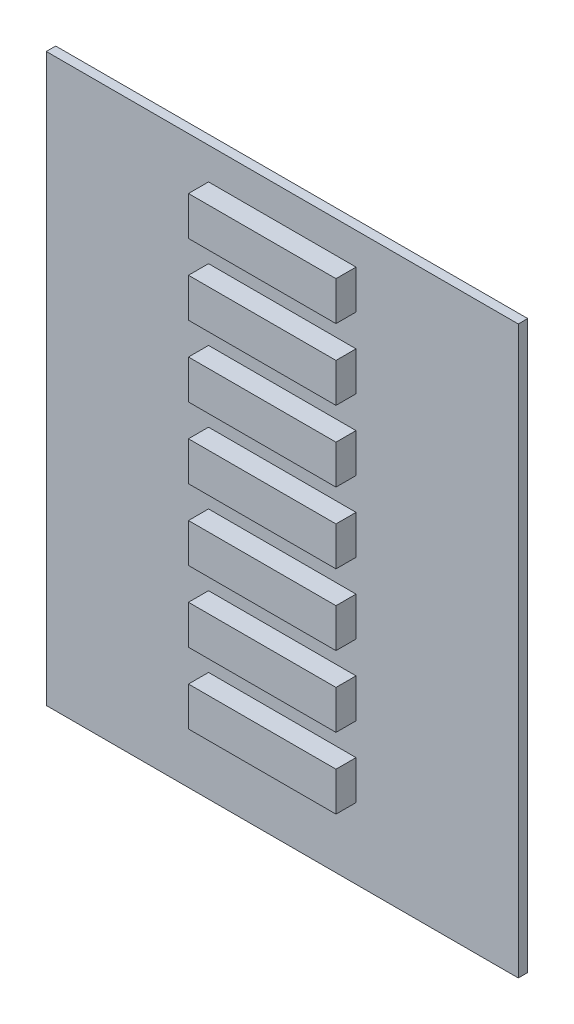
ISO-10303-21;
HEADER;
FILE_DESCRIPTION(('STEP AP214'),'2;1');
FILE_NAME('part.step','',(''),(''),'','','');
FILE_SCHEMA(('AUTOMOTIVE_DESIGN { 1 0 10303 214 1 1 1 1 }'));
ENDSEC;
DATA;
#1=APPLICATION_CONTEXT('core data for automotive mechanical design processes');
#2=APPLICATION_PROTOCOL_DEFINITION('international standard','automotive_design',2000,#1);
#3=PRODUCT_CONTEXT('',#1,'mechanical');
#4=PRODUCT('Part','Part','',(#3));
#5=PRODUCT_RELATED_PRODUCT_CATEGORY('part','',(#4));
#6=PRODUCT_DEFINITION_FORMATION('','',#4);
#7=PRODUCT_DEFINITION_CONTEXT('part definition',#1,'design');
#8=PRODUCT_DEFINITION('design','',#6,#7);
#9=PRODUCT_DEFINITION_SHAPE('','',#8);
#10=(LENGTH_UNIT() NAMED_UNIT(*) SI_UNIT(.MILLI.,.METRE.));
#11=(NAMED_UNIT(*) PLANE_ANGLE_UNIT() SI_UNIT($,.RADIAN.));
#12=(NAMED_UNIT(*) SI_UNIT($,.STERADIAN.) SOLID_ANGLE_UNIT());
#13=UNCERTAINTY_MEASURE_WITH_UNIT(LENGTH_MEASURE(1.E-05),#10,'distance_accuracy_value','');
#14=(GEOMETRIC_REPRESENTATION_CONTEXT(3) GLOBAL_UNCERTAINTY_ASSIGNED_CONTEXT((#13)) GLOBAL_UNIT_ASSIGNED_CONTEXT((#10,
#11,#12)) REPRESENTATION_CONTEXT('',''));
#15=CARTESIAN_POINT('',(0.,0.,0.));
#16=DIRECTION('',(0.,0.,1.));
#17=DIRECTION('',(1.,0.,0.));
#18=AXIS2_PLACEMENT_3D('',#15,#16,#17);
#19=CARTESIAN_POINT('',(0.,0.,-41.));
#20=DIRECTION('',(0.,0.,1.));
#21=DIRECTION('',(1.,0.,0.));
#22=AXIS2_PLACEMENT_3D('',#19,#20,#21);
#23=PLANE('',#22);
#24=DIRECTION('',(0.,1.,0.));
#25=VECTOR('',#24,1.);
#26=CARTESIAN_POINT('',(40.,48.,-41.));
#27=LINE('',#26,#25);
#28=CARTESIAN_POINT('',(40.,-48.,-41.));
#29=VERTEX_POINT('',#28);
#30=CARTESIAN_POINT('',(40.,48.,-41.));
#31=VERTEX_POINT('',#30);
#32=EDGE_CURVE('E536',#29,#31,#27,.T.);
#33=ORIENTED_EDGE('',*,*,#32,.T.);
#34=DIRECTION('',(-1.,0.,0.));
#35=VECTOR('',#34,1.);
#36=CARTESIAN_POINT('',(-40.,48.,-41.));
#37=LINE('',#36,#35);
#38=CARTESIAN_POINT('',(-40.,48.,-41.));
#39=VERTEX_POINT('',#38);
#40=EDGE_CURVE('E540',#31,#39,#37,.T.);
#41=ORIENTED_EDGE('',*,*,#40,.T.);
#42=DIRECTION('',(0.,-1.,0.));
#43=VECTOR('',#42,1.);
#44=CARTESIAN_POINT('',(-40.,48.,-41.));
#45=LINE('',#44,#43);
#46=CARTESIAN_POINT('',(-40.,-48.,-41.));
#47=VERTEX_POINT('',#46);
#48=EDGE_CURVE('E543',#39,#47,#45,.T.);
#49=ORIENTED_EDGE('',*,*,#48,.T.);
#50=DIRECTION('',(1.,0.,0.));
#51=VECTOR('',#50,1.);
#52=CARTESIAN_POINT('',(-40.,-48.,-41.));
#53=LINE('',#52,#51);
#54=EDGE_CURVE('E545',#47,#29,#53,.T.);
#55=ORIENTED_EDGE('',*,*,#54,.T.);
#56=EDGE_LOOP('',(#33,#41,#49,#55));
#57=FACE_BOUND('',#56,.T.);
#58=DIRECTION('',(-1.,0.,0.));
#59=VECTOR('',#58,1.);
#60=CARTESIAN_POINT('',(0.,36.,-41.));
#61=LINE('',#60,#59);
#62=CARTESIAN_POINT('',(12.5,36.,-41.));
#63=VERTEX_POINT('',#62);
#64=CARTESIAN_POINT('',(-12.5,36.,-41.));
#65=VERTEX_POINT('',#64);
#66=EDGE_CURVE('E529',#63,#65,#61,.T.);
#67=ORIENTED_EDGE('',*,*,#66,.T.);
#68=DIRECTION('',(0.,1.,0.));
#69=VECTOR('',#68,1.);
#70=CARTESIAN_POINT('',(-12.5,0.,-41.));
#71=LINE('',#70,#69);
#72=CARTESIAN_POINT('',(-12.5,42.6,-41.));
#73=VERTEX_POINT('',#72);
#74=EDGE_CURVE('E532',#65,#73,#71,.T.);
#75=ORIENTED_EDGE('',*,*,#74,.T.);
#76=DIRECTION('',(1.,0.,0.));
#77=VECTOR('',#76,1.);
#78=CARTESIAN_POINT('',(0.,42.6,-41.));
#79=LINE('',#78,#77);
#80=CARTESIAN_POINT('',(12.5,42.6,-41.));
#81=VERTEX_POINT('',#80);
#82=EDGE_CURVE('E523',#73,#81,#79,.T.);
#83=ORIENTED_EDGE('',*,*,#82,.T.);
#84=DIRECTION('',(0.,-1.,0.));
#85=VECTOR('',#84,1.);
#86=CARTESIAN_POINT('',(12.5,0.,-41.));
#87=LINE('',#86,#85);
#88=EDGE_CURVE('E526',#81,#63,#87,.T.);
#89=ORIENTED_EDGE('',*,*,#88,.T.);
#90=EDGE_LOOP('',(#67,#75,#83,#89));
#91=FACE_BOUND('',#90,.T.);
#92=DIRECTION('',(-1.,0.,0.));
#93=VECTOR('',#92,1.);
#94=CARTESIAN_POINT('',(0.,24.,-41.));
#95=LINE('',#94,#93);
#96=CARTESIAN_POINT('',(12.5,24.,-41.));
#97=VERTEX_POINT('',#96);
#98=CARTESIAN_POINT('',(-12.5,24.,-41.));
#99=VERTEX_POINT('',#98);
#100=EDGE_CURVE('E497',#97,#99,#95,.T.);
#101=ORIENTED_EDGE('',*,*,#100,.T.);
#102=DIRECTION('',(0.,1.,0.));
#103=VECTOR('',#102,1.);
#104=CARTESIAN_POINT('',(-12.5,0.,-41.));
#105=LINE('',#104,#103);
#106=CARTESIAN_POINT('',(-12.5,30.6,-41.));
#107=VERTEX_POINT('',#106);
#108=EDGE_CURVE('E500',#99,#107,#105,.T.);
#109=ORIENTED_EDGE('',*,*,#108,.T.);
#110=DIRECTION('',(1.,0.,0.));
#111=VECTOR('',#110,1.);
#112=CARTESIAN_POINT('',(0.,30.6,-41.));
#113=LINE('',#112,#111);
#114=CARTESIAN_POINT('',(12.5,30.6,-41.));
#115=VERTEX_POINT('',#114);
#116=EDGE_CURVE('E491',#107,#115,#113,.T.);
#117=ORIENTED_EDGE('',*,*,#116,.T.);
#118=DIRECTION('',(0.,-1.,0.));
#119=VECTOR('',#118,1.);
#120=CARTESIAN_POINT('',(12.5,0.,-41.));
#121=LINE('',#120,#119);
#122=EDGE_CURVE('E494',#115,#97,#121,.T.);
#123=ORIENTED_EDGE('',*,*,#122,.T.);
#124=EDGE_LOOP('',(#101,#109,#117,#123));
#125=FACE_BOUND('',#124,.T.);
#126=DIRECTION('',(-1.,0.,0.));
#127=VECTOR('',#126,1.);
#128=CARTESIAN_POINT('',(0.,12.,-41.));
#129=LINE('',#128,#127);
#130=CARTESIAN_POINT('',(12.5,12.,-41.));
#131=VERTEX_POINT('',#130);
#132=CARTESIAN_POINT('',(-12.5,12.,-41.));
#133=VERTEX_POINT('',#132);
#134=EDGE_CURVE('E463',#131,#133,#129,.T.);
#135=ORIENTED_EDGE('',*,*,#134,.T.);
#136=DIRECTION('',(0.,1.,0.));
#137=VECTOR('',#136,1.);
#138=CARTESIAN_POINT('',(-12.5,0.,-41.));
#139=LINE('',#138,#137);
#140=CARTESIAN_POINT('',(-12.5,18.6,-41.));
#141=VERTEX_POINT('',#140);
#142=EDGE_CURVE('E467',#133,#141,#139,.T.);
#143=ORIENTED_EDGE('',*,*,#142,.T.);
#144=DIRECTION('',(1.,0.,0.));
#145=VECTOR('',#144,1.);
#146=CARTESIAN_POINT('',(0.,18.6,-41.));
#147=LINE('',#146,#145);
#148=CARTESIAN_POINT('',(12.5,18.6,-41.));
#149=VERTEX_POINT('',#148);
#150=EDGE_CURVE('E457',#141,#149,#147,.T.);
#151=ORIENTED_EDGE('',*,*,#150,.T.);
#152=DIRECTION('',(0.,-1.,0.));
#153=VECTOR('',#152,1.);
#154=CARTESIAN_POINT('',(12.5,0.,-41.));
#155=LINE('',#154,#153);
#156=EDGE_CURVE('E460',#149,#131,#155,.T.);
#157=ORIENTED_EDGE('',*,*,#156,.T.);
#158=EDGE_LOOP('',(#135,#143,#151,#157));
#159=FACE_BOUND('',#158,.T.);
#160=DIRECTION('',(-1.,0.,0.));
#161=VECTOR('',#160,1.);
#162=CARTESIAN_POINT('',(0.,0.,-41.));
#163=LINE('',#162,#161);
#164=CARTESIAN_POINT('',(12.5,0.,-41.));
#165=VERTEX_POINT('',#164);
#166=CARTESIAN_POINT('',(-12.5,0.,-41.));
#167=VERTEX_POINT('',#166);
#168=EDGE_CURVE('E426',#165,#167,#163,.T.);
#169=ORIENTED_EDGE('',*,*,#168,.T.);
#170=DIRECTION('',(0.,1.,0.));
#171=VECTOR('',#170,1.);
#172=CARTESIAN_POINT('',(-12.5,0.,-41.));
#173=LINE('',#172,#171);
#174=CARTESIAN_POINT('',(-12.5,6.6,-41.));
#175=VERTEX_POINT('',#174);
#176=EDGE_CURVE('E430',#167,#175,#173,.T.);
#177=ORIENTED_EDGE('',*,*,#176,.T.);
#178=DIRECTION('',(1.,0.,0.));
#179=VECTOR('',#178,1.);
#180=CARTESIAN_POINT('',(0.,6.6,-41.));
#181=LINE('',#180,#179);
#182=CARTESIAN_POINT('',(12.5,6.6,-41.));
#183=VERTEX_POINT('',#182);
#184=EDGE_CURVE('E418',#175,#183,#181,.T.);
#185=ORIENTED_EDGE('',*,*,#184,.T.);
#186=DIRECTION('',(0.,-1.,0.));
#187=VECTOR('',#186,1.);
#188=CARTESIAN_POINT('',(12.5,0.,-41.));
#189=LINE('',#188,#187);
#190=EDGE_CURVE('E422',#183,#165,#189,.T.);
#191=ORIENTED_EDGE('',*,*,#190,.T.);
#192=EDGE_LOOP('',(#169,#177,#185,#191));
#193=FACE_BOUND('',#192,.T.);
#194=DIRECTION('',(-1.,0.,0.));
#195=VECTOR('',#194,1.);
#196=CARTESIAN_POINT('',(0.,-12.,-41.));
#197=LINE('',#196,#195);
#198=CARTESIAN_POINT('',(12.5,-12.,-41.));
#199=VERTEX_POINT('',#198);
#200=CARTESIAN_POINT('',(-12.5,-12.,-41.));
#201=VERTEX_POINT('',#200);
#202=EDGE_CURVE('E382',#199,#201,#197,.T.);
#203=ORIENTED_EDGE('',*,*,#202,.T.);
#204=DIRECTION('',(0.,1.,0.));
#205=VECTOR('',#204,1.);
#206=CARTESIAN_POINT('',(-12.5,0.,-41.));
#207=LINE('',#206,#205);
#208=CARTESIAN_POINT('',(-12.5,-5.4,-41.));
#209=VERTEX_POINT('',#208);
#210=EDGE_CURVE('E386',#201,#209,#207,.T.);
#211=ORIENTED_EDGE('',*,*,#210,.T.);
#212=DIRECTION('',(1.,0.,0.));
#213=VECTOR('',#212,1.);
#214=CARTESIAN_POINT('',(0.,-5.4,-41.));
#215=LINE('',#214,#213);
#216=CARTESIAN_POINT('',(12.5,-5.4,-41.));
#217=VERTEX_POINT('',#216);
#218=EDGE_CURVE('E374',#209,#217,#215,.T.);
#219=ORIENTED_EDGE('',*,*,#218,.T.);
#220=DIRECTION('',(0.,-1.,0.));
#221=VECTOR('',#220,1.);
#222=CARTESIAN_POINT('',(12.5,0.,-41.));
#223=LINE('',#222,#221);
#224=EDGE_CURVE('E378',#217,#199,#223,.T.);
#225=ORIENTED_EDGE('',*,*,#224,.T.);
#226=EDGE_LOOP('',(#203,#211,#219,#225));
#227=FACE_BOUND('',#226,.T.);
#228=DIRECTION('',(-1.,0.,0.));
#229=VECTOR('',#228,1.);
#230=CARTESIAN_POINT('',(0.,-24.,-41.));
#231=LINE('',#230,#229);
#232=CARTESIAN_POINT('',(12.5,-24.,-41.));
#233=VERTEX_POINT('',#232);
#234=CARTESIAN_POINT('',(-12.5,-24.,-41.));
#235=VERTEX_POINT('',#234);
#236=EDGE_CURVE('E339',#233,#235,#231,.T.);
#237=ORIENTED_EDGE('',*,*,#236,.T.);
#238=DIRECTION('',(0.,1.,0.));
#239=VECTOR('',#238,1.);
#240=CARTESIAN_POINT('',(-12.5,0.,-41.));
#241=LINE('',#240,#239);
#242=CARTESIAN_POINT('',(-12.5,-17.4,-41.));
#243=VERTEX_POINT('',#242);
#244=EDGE_CURVE('E342',#235,#243,#241,.T.);
#245=ORIENTED_EDGE('',*,*,#244,.T.);
#246=DIRECTION('',(1.,0.,0.));
#247=VECTOR('',#246,1.);
#248=CARTESIAN_POINT('',(0.,-17.4,-41.));
#249=LINE('',#248,#247);
#250=CARTESIAN_POINT('',(12.5,-17.4,-41.));
#251=VERTEX_POINT('',#250);
#252=EDGE_CURVE('E331',#243,#251,#249,.T.);
#253=ORIENTED_EDGE('',*,*,#252,.T.);
#254=DIRECTION('',(0.,-1.,0.));
#255=VECTOR('',#254,1.);
#256=CARTESIAN_POINT('',(12.5,0.,-41.));
#257=LINE('',#256,#255);
#258=EDGE_CURVE('E335',#251,#233,#257,.T.);
#259=ORIENTED_EDGE('',*,*,#258,.T.);
#260=EDGE_LOOP('',(#237,#245,#253,#259));
#261=FACE_BOUND('',#260,.T.);
#262=DIRECTION('',(-1.,0.,0.));
#263=VECTOR('',#262,1.);
#264=CARTESIAN_POINT('',(0.,-36.,-41.));
#265=LINE('',#264,#263);
#266=CARTESIAN_POINT('',(12.5,-36.,-41.));
#267=VERTEX_POINT('',#266);
#268=CARTESIAN_POINT('',(-12.5,-36.,-41.));
#269=VERTEX_POINT('',#268);
#270=EDGE_CURVE('E306',#267,#269,#265,.T.);
#271=ORIENTED_EDGE('',*,*,#270,.T.);
#272=DIRECTION('',(0.,1.,0.));
#273=VECTOR('',#272,1.);
#274=CARTESIAN_POINT('',(-12.5000000000001,0.,-41.));
#275=LINE('',#274,#273);
#276=CARTESIAN_POINT('',(-12.5,-29.4,-41.));
#277=VERTEX_POINT('',#276);
#278=EDGE_CURVE('E293',#269,#277,#275,.T.);
#279=ORIENTED_EDGE('',*,*,#278,.T.);
#280=DIRECTION('',(1.,0.,0.));
#281=VECTOR('',#280,1.);
#282=CARTESIAN_POINT('',(0.,-29.4,-41.));
#283=LINE('',#282,#281);
#284=CARTESIAN_POINT('',(12.5,-29.4,-41.));
#285=VERTEX_POINT('',#284);
#286=EDGE_CURVE('E294',#277,#285,#283,.T.);
#287=ORIENTED_EDGE('',*,*,#286,.T.);
#288=DIRECTION('',(0.,-1.,0.));
#289=VECTOR('',#288,1.);
#290=CARTESIAN_POINT('',(12.5000000000001,0.,-41.));
#291=LINE('',#290,#289);
#292=EDGE_CURVE('E297',#285,#267,#291,.T.);
#293=ORIENTED_EDGE('',*,*,#292,.T.);
#294=EDGE_LOOP('',(#271,#279,#287,#293));
#295=FACE_BOUND('',#294,.T.);
#296=ADVANCED_FACE('F38',(#57,#91,#125,#159,#193,#227,#261,#295),#23,.T.);
#297=CARTESIAN_POINT('',(40.,48.,-41.));
#298=DIRECTION('',(-1.,0.,0.));
#299=DIRECTION('',(0.,-1.,0.));
#300=AXIS2_PLACEMENT_3D('',#297,#298,#299);
#301=PLANE('',#300);
#302=DIRECTION('',(0.,1.,0.));
#303=VECTOR('',#302,1.);
#304=CARTESIAN_POINT('',(40.,48.,-42.6));
#305=LINE('',#304,#303);
#306=CARTESIAN_POINT('',(40.,-48.,-42.6));
#307=VERTEX_POINT('',#306);
#308=CARTESIAN_POINT('',(40.,48.,-42.6));
#309=VERTEX_POINT('',#308);
#310=EDGE_CURVE('E535',#307,#309,#305,.T.);
#311=ORIENTED_EDGE('',*,*,#310,.T.);
#312=DIRECTION('',(0.,0.,-1.));
#313=VECTOR('',#312,1.);
#314=CARTESIAN_POINT('',(40.,48.,-41.));
#315=LINE('',#314,#313);
#316=EDGE_CURVE('E11',#31,#309,#315,.T.);
#317=ORIENTED_EDGE('',*,*,#316,.F.);
#318=ORIENTED_EDGE('',*,*,#32,.F.);
#319=DIRECTION('',(0.,0.,-1.));
#320=VECTOR('',#319,1.);
#321=CARTESIAN_POINT('',(40.,-48.,-41.));
#322=LINE('',#321,#320);
#323=EDGE_CURVE('E548',#29,#307,#322,.T.);
#324=ORIENTED_EDGE('',*,*,#323,.T.);
#325=EDGE_LOOP('',(#311,#317,#318,#324));
#326=FACE_BOUND('',#325,.T.);
#327=ADVANCED_FACE('F40',(#326),#301,.F.);
#328=CARTESIAN_POINT('',(-40.,48.,-41.));
#329=DIRECTION('',(0.,-1.,0.));
#330=DIRECTION('',(0.,0.,-1.));
#331=AXIS2_PLACEMENT_3D('',#328,#329,#330);
#332=PLANE('',#331);
#333=DIRECTION('',(-1.,0.,0.));
#334=VECTOR('',#333,1.);
#335=CARTESIAN_POINT('',(-40.,48.,-42.6));
#336=LINE('',#335,#334);
#337=CARTESIAN_POINT('',(-40.,48.,-42.6));
#338=VERTEX_POINT('',#337);
#339=EDGE_CURVE('E552',#309,#338,#336,.T.);
#340=ORIENTED_EDGE('',*,*,#339,.T.);
#341=DIRECTION('',(0.,0.,-1.));
#342=VECTOR('',#341,1.);
#343=CARTESIAN_POINT('',(-40.,48.,-41.));
#344=LINE('',#343,#342);
#345=EDGE_CURVE('E46',#39,#338,#344,.T.);
#346=ORIENTED_EDGE('',*,*,#345,.F.);
#347=ORIENTED_EDGE('',*,*,#40,.F.);
#348=ORIENTED_EDGE('',*,*,#316,.T.);
#349=EDGE_LOOP('',(#340,#346,#347,#348));
#350=FACE_BOUND('',#349,.T.);
#351=ADVANCED_FACE('F583',(#350),#332,.F.);
#352=CARTESIAN_POINT('',(-40.,48.,-41.));
#353=DIRECTION('',(1.,0.,0.));
#354=DIRECTION('',(0.,1.,0.));
#355=AXIS2_PLACEMENT_3D('',#352,#353,#354);
#356=PLANE('',#355);
#357=DIRECTION('',(0.,-1.,0.));
#358=VECTOR('',#357,1.);
#359=CARTESIAN_POINT('',(-40.,48.,-42.6));
#360=LINE('',#359,#358);
#361=CARTESIAN_POINT('',(-40.,-48.,-42.6));
#362=VERTEX_POINT('',#361);
#363=EDGE_CURVE('E554',#338,#362,#360,.T.);
#364=ORIENTED_EDGE('',*,*,#363,.T.);
#365=DIRECTION('',(0.,0.,-1.));
#366=VECTOR('',#365,1.);
#367=CARTESIAN_POINT('',(-40.,-48.,-41.));
#368=LINE('',#367,#366);
#369=EDGE_CURVE('E560',#47,#362,#368,.T.);
#370=ORIENTED_EDGE('',*,*,#369,.F.);
#371=ORIENTED_EDGE('',*,*,#48,.F.);
#372=ORIENTED_EDGE('',*,*,#345,.T.);
#373=EDGE_LOOP('',(#364,#370,#371,#372));
#374=FACE_BOUND('',#373,.T.);
#375=ADVANCED_FACE('F567',(#374),#356,.F.);
#376=CARTESIAN_POINT('',(-40.,-48.,-41.));
#377=DIRECTION('',(0.,1.,0.));
#378=DIRECTION('',(0.,0.,1.));
#379=AXIS2_PLACEMENT_3D('',#376,#377,#378);
#380=PLANE('',#379);
#381=DIRECTION('',(1.,0.,0.));
#382=VECTOR('',#381,1.);
#383=CARTESIAN_POINT('',(-40.,-48.,-42.6));
#384=LINE('',#383,#382);
#385=EDGE_CURVE('E541',#362,#307,#384,.T.);
#386=ORIENTED_EDGE('',*,*,#385,.T.);
#387=ORIENTED_EDGE('',*,*,#323,.F.);
#388=ORIENTED_EDGE('',*,*,#54,.F.);
#389=ORIENTED_EDGE('',*,*,#369,.T.);
#390=EDGE_LOOP('',(#386,#387,#388,#389));
#391=FACE_BOUND('',#390,.T.);
#392=ADVANCED_FACE('F576',(#391),#380,.F.);
#393=CARTESIAN_POINT('',(0.,0.,-42.6));
#394=DIRECTION('',(0.,0.,1.));
#395=DIRECTION('',(1.,0.,0.));
#396=AXIS2_PLACEMENT_3D('',#393,#394,#395);
#397=PLANE('',#396);
#398=ORIENTED_EDGE('',*,*,#310,.F.);
#399=ORIENTED_EDGE('',*,*,#385,.F.);
#400=ORIENTED_EDGE('',*,*,#363,.F.);
#401=ORIENTED_EDGE('',*,*,#339,.F.);
#402=EDGE_LOOP('',(#398,#399,#400,#401));
#403=FACE_BOUND('',#402,.T.);
#404=ADVANCED_FACE('F573',(#403),#397,.F.);
#405=CARTESIAN_POINT('',(-12.5,42.6,-37.6));
#406=DIRECTION('',(1.,0.,0.));
#407=DIRECTION('',(0.,1.,0.));
#408=AXIS2_PLACEMENT_3D('',#405,#406,#407);
#409=PLANE('',#408);
#410=ORIENTED_EDGE('',*,*,#74,.F.);
#411=DIRECTION('',(0.,0.,-1.));
#412=VECTOR('',#411,1.);
#413=CARTESIAN_POINT('',(-12.5,36.,-37.6));
#414=LINE('',#413,#412);
#415=CARTESIAN_POINT('',(-12.5,36.,-37.6));
#416=VERTEX_POINT('',#415);
#417=EDGE_CURVE('E520',#416,#65,#414,.T.);
#418=ORIENTED_EDGE('',*,*,#417,.F.);
#419=DIRECTION('',(0.,-1.,0.));
#420=VECTOR('',#419,1.);
#421=CARTESIAN_POINT('',(-12.5,42.6,-37.6));
#422=LINE('',#421,#420);
#423=CARTESIAN_POINT('',(-12.5,42.6,-37.6));
#424=VERTEX_POINT('',#423);
#425=EDGE_CURVE('E503',#424,#416,#422,.T.);
#426=ORIENTED_EDGE('',*,*,#425,.F.);
#427=DIRECTION('',(0.,0.,-1.));
#428=VECTOR('',#427,1.);
#429=CARTESIAN_POINT('',(-12.5,42.6,-37.6));
#430=LINE('',#429,#428);
#431=EDGE_CURVE('E512',#424,#73,#430,.T.);
#432=ORIENTED_EDGE('',*,*,#431,.T.);
#433=EDGE_LOOP('',(#410,#418,#426,#432));
#434=FACE_BOUND('',#433,.T.);
#435=ADVANCED_FACE('F596',(#434),#409,.F.);
#436=CARTESIAN_POINT('',(-12.5,36.,-37.6));
#437=DIRECTION('',(0.,1.,0.));
#438=DIRECTION('',(0.,0.,1.));
#439=AXIS2_PLACEMENT_3D('',#436,#437,#438);
#440=PLANE('',#439);
#441=ORIENTED_EDGE('',*,*,#66,.F.);
#442=DIRECTION('',(0.,0.,-1.));
#443=VECTOR('',#442,1.);
#444=CARTESIAN_POINT('',(12.5,36.,-37.6));
#445=LINE('',#444,#443);
#446=CARTESIAN_POINT('',(12.5,36.,-37.6));
#447=VERTEX_POINT('',#446);
#448=EDGE_CURVE('E517',#447,#63,#445,.T.);
#449=ORIENTED_EDGE('',*,*,#448,.F.);
#450=DIRECTION('',(1.,0.,0.));
#451=VECTOR('',#450,1.);
#452=CARTESIAN_POINT('',(-12.5,36.,-37.6));
#453=LINE('',#452,#451);
#454=EDGE_CURVE('E506',#416,#447,#453,.T.);
#455=ORIENTED_EDGE('',*,*,#454,.F.);
#456=ORIENTED_EDGE('',*,*,#417,.T.);
#457=EDGE_LOOP('',(#441,#449,#455,#456));
#458=FACE_BOUND('',#457,.T.);
#459=ADVANCED_FACE('F616',(#458),#440,.F.);
#460=CARTESIAN_POINT('',(12.5,42.6,-37.6));
#461=DIRECTION('',(-1.,0.,0.));
#462=DIRECTION('',(0.,-1.,0.));
#463=AXIS2_PLACEMENT_3D('',#460,#461,#462);
#464=PLANE('',#463);
#465=ORIENTED_EDGE('',*,*,#88,.F.);
#466=DIRECTION('',(0.,0.,-1.));
#467=VECTOR('',#466,1.);
#468=CARTESIAN_POINT('',(12.5,42.6,-37.6));
#469=LINE('',#468,#467);
#470=CARTESIAN_POINT('',(12.5,42.6,-37.6));
#471=VERTEX_POINT('',#470);
#472=EDGE_CURVE('E515',#471,#81,#469,.T.);
#473=ORIENTED_EDGE('',*,*,#472,.F.);
#474=DIRECTION('',(0.,1.,0.));
#475=VECTOR('',#474,1.);
#476=CARTESIAN_POINT('',(12.5,42.6,-37.6));
#477=LINE('',#476,#475);
#478=EDGE_CURVE('E508',#447,#471,#477,.T.);
#479=ORIENTED_EDGE('',*,*,#478,.F.);
#480=ORIENTED_EDGE('',*,*,#448,.T.);
#481=EDGE_LOOP('',(#465,#473,#479,#480));
#482=FACE_BOUND('',#481,.T.);
#483=ADVANCED_FACE('F623',(#482),#464,.F.);
#484=CARTESIAN_POINT('',(-12.5,42.6,-37.6));
#485=DIRECTION('',(0.,-1.,0.));
#486=DIRECTION('',(0.,0.,-1.));
#487=AXIS2_PLACEMENT_3D('',#484,#485,#486);
#488=PLANE('',#487);
#489=ORIENTED_EDGE('',*,*,#82,.F.);
#490=ORIENTED_EDGE('',*,*,#431,.F.);
#491=DIRECTION('',(-1.,0.,0.));
#492=VECTOR('',#491,1.);
#493=CARTESIAN_POINT('',(-12.5,42.6,-37.6));
#494=LINE('',#493,#492);
#495=EDGE_CURVE('E510',#471,#424,#494,.T.);
#496=ORIENTED_EDGE('',*,*,#495,.F.);
#497=ORIENTED_EDGE('',*,*,#472,.T.);
#498=EDGE_LOOP('',(#489,#490,#496,#497));
#499=FACE_BOUND('',#498,.T.);
#500=ADVANCED_FACE('F630',(#499),#488,.F.);
#501=CARTESIAN_POINT('',(0.,0.,-37.6));
#502=DIRECTION('',(0.,0.,1.));
#503=DIRECTION('',(1.,0.,0.));
#504=AXIS2_PLACEMENT_3D('',#501,#502,#503);
#505=PLANE('',#504);
#506=ORIENTED_EDGE('',*,*,#425,.T.);
#507=ORIENTED_EDGE('',*,*,#454,.T.);
#508=ORIENTED_EDGE('',*,*,#478,.T.);
#509=ORIENTED_EDGE('',*,*,#495,.T.);
#510=EDGE_LOOP('',(#506,#507,#508,#509));
#511=FACE_BOUND('',#510,.T.);
#512=ADVANCED_FACE('F638',(#511),#505,.T.);
#513=CARTESIAN_POINT('',(-12.5,30.6,-37.6));
#514=DIRECTION('',(1.,0.,0.));
#515=DIRECTION('',(0.,1.,0.));
#516=AXIS2_PLACEMENT_3D('',#513,#514,#515);
#517=PLANE('',#516);
#518=ORIENTED_EDGE('',*,*,#108,.F.);
#519=DIRECTION('',(0.,0.,-1.));
#520=VECTOR('',#519,1.);
#521=CARTESIAN_POINT('',(-12.5,24.,-37.6));
#522=LINE('',#521,#520);
#523=CARTESIAN_POINT('',(-12.5,24.,-37.6));
#524=VERTEX_POINT('',#523);
#525=EDGE_CURVE('E488',#524,#99,#522,.T.);
#526=ORIENTED_EDGE('',*,*,#525,.F.);
#527=DIRECTION('',(0.,-1.,0.));
#528=VECTOR('',#527,1.);
#529=CARTESIAN_POINT('',(-12.5,30.6,-37.6));
#530=LINE('',#529,#528);
#531=CARTESIAN_POINT('',(-12.5,30.6,-37.6));
#532=VERTEX_POINT('',#531);
#533=EDGE_CURVE('E471',#532,#524,#530,.T.);
#534=ORIENTED_EDGE('',*,*,#533,.F.);
#535=DIRECTION('',(0.,0.,-1.));
#536=VECTOR('',#535,1.);
#537=CARTESIAN_POINT('',(-12.5,30.6,-37.6));
#538=LINE('',#537,#536);
#539=EDGE_CURVE('E480',#532,#107,#538,.T.);
#540=ORIENTED_EDGE('',*,*,#539,.T.);
#541=EDGE_LOOP('',(#518,#526,#534,#540));
#542=FACE_BOUND('',#541,.T.);
#543=ADVANCED_FACE('F646',(#542),#517,.F.);
#544=CARTESIAN_POINT('',(-12.5,24.,-37.6));
#545=DIRECTION('',(0.,1.,0.));
#546=DIRECTION('',(0.,0.,1.));
#547=AXIS2_PLACEMENT_3D('',#544,#545,#546);
#548=PLANE('',#547);
#549=ORIENTED_EDGE('',*,*,#100,.F.);
#550=DIRECTION('',(0.,0.,-1.));
#551=VECTOR('',#550,1.);
#552=CARTESIAN_POINT('',(12.5,24.,-37.6));
#553=LINE('',#552,#551);
#554=CARTESIAN_POINT('',(12.5,24.,-37.6));
#555=VERTEX_POINT('',#554);
#556=EDGE_CURVE('E485',#555,#97,#553,.T.);
#557=ORIENTED_EDGE('',*,*,#556,.F.);
#558=DIRECTION('',(1.,0.,0.));
#559=VECTOR('',#558,1.);
#560=CARTESIAN_POINT('',(-12.5,24.,-37.6));
#561=LINE('',#560,#559);
#562=EDGE_CURVE('E474',#524,#555,#561,.T.);
#563=ORIENTED_EDGE('',*,*,#562,.F.);
#564=ORIENTED_EDGE('',*,*,#525,.T.);
#565=EDGE_LOOP('',(#549,#557,#563,#564));
#566=FACE_BOUND('',#565,.T.);
#567=ADVANCED_FACE('F654',(#566),#548,.F.);
#568=CARTESIAN_POINT('',(12.5,30.6,-37.6));
#569=DIRECTION('',(-1.,0.,0.));
#570=DIRECTION('',(0.,-1.,0.));
#571=AXIS2_PLACEMENT_3D('',#568,#569,#570);
#572=PLANE('',#571);
#573=ORIENTED_EDGE('',*,*,#122,.F.);
#574=DIRECTION('',(0.,0.,-1.));
#575=VECTOR('',#574,1.);
#576=CARTESIAN_POINT('',(12.5,30.6,-37.6));
#577=LINE('',#576,#575);
#578=CARTESIAN_POINT('',(12.5,30.6,-37.6));
#579=VERTEX_POINT('',#578);
#580=EDGE_CURVE('E483',#579,#115,#577,.T.);
#581=ORIENTED_EDGE('',*,*,#580,.F.);
#582=DIRECTION('',(0.,1.,0.));
#583=VECTOR('',#582,1.);
#584=CARTESIAN_POINT('',(12.5,30.6,-37.6));
#585=LINE('',#584,#583);
#586=EDGE_CURVE('E476',#555,#579,#585,.T.);
#587=ORIENTED_EDGE('',*,*,#586,.F.);
#588=ORIENTED_EDGE('',*,*,#556,.T.);
#589=EDGE_LOOP('',(#573,#581,#587,#588));
#590=FACE_BOUND('',#589,.T.);
#591=ADVANCED_FACE('F662',(#590),#572,.F.);
#592=CARTESIAN_POINT('',(-12.5,30.6,-37.6));
#593=DIRECTION('',(0.,-1.,0.));
#594=DIRECTION('',(0.,0.,-1.));
#595=AXIS2_PLACEMENT_3D('',#592,#593,#594);
#596=PLANE('',#595);
#597=ORIENTED_EDGE('',*,*,#116,.F.);
#598=ORIENTED_EDGE('',*,*,#539,.F.);
#599=DIRECTION('',(-1.,0.,0.));
#600=VECTOR('',#599,1.);
#601=CARTESIAN_POINT('',(-12.5,30.6,-37.6));
#602=LINE('',#601,#600);
#603=EDGE_CURVE('E478',#579,#532,#602,.T.);
#604=ORIENTED_EDGE('',*,*,#603,.F.);
#605=ORIENTED_EDGE('',*,*,#580,.T.);
#606=EDGE_LOOP('',(#597,#598,#604,#605));
#607=FACE_BOUND('',#606,.T.);
#608=ADVANCED_FACE('F670',(#607),#596,.F.);
#609=CARTESIAN_POINT('',(0.,0.,-37.6));
#610=DIRECTION('',(0.,0.,1.));
#611=DIRECTION('',(1.,0.,0.));
#612=AXIS2_PLACEMENT_3D('',#609,#610,#611);
#613=PLANE('',#612);
#614=ORIENTED_EDGE('',*,*,#533,.T.);
#615=ORIENTED_EDGE('',*,*,#562,.T.);
#616=ORIENTED_EDGE('',*,*,#586,.T.);
#617=ORIENTED_EDGE('',*,*,#603,.T.);
#618=EDGE_LOOP('',(#614,#615,#616,#617));
#619=FACE_BOUND('',#618,.T.);
#620=ADVANCED_FACE('F678',(#619),#613,.T.);
#621=CARTESIAN_POINT('',(-12.5,18.6,-37.6));
#622=DIRECTION('',(1.,0.,0.));
#623=DIRECTION('',(0.,1.,0.));
#624=AXIS2_PLACEMENT_3D('',#621,#622,#623);
#625=PLANE('',#624);
#626=ORIENTED_EDGE('',*,*,#142,.F.);
#627=DIRECTION('',(0.,0.,-1.));
#628=VECTOR('',#627,1.);
#629=CARTESIAN_POINT('',(-12.5,12.,-37.6));
#630=LINE('',#629,#628);
#631=CARTESIAN_POINT('',(-12.5,12.,-37.6));
#632=VERTEX_POINT('',#631);
#633=EDGE_CURVE('E453',#632,#133,#630,.T.);
#634=ORIENTED_EDGE('',*,*,#633,.F.);
#635=DIRECTION('',(0.,-1.,0.));
#636=VECTOR('',#635,1.);
#637=CARTESIAN_POINT('',(-12.5,18.6,-37.6));
#638=LINE('',#637,#636);
#639=CARTESIAN_POINT('',(-12.5,18.6,-37.6));
#640=VERTEX_POINT('',#639);
#641=EDGE_CURVE('E434',#640,#632,#638,.T.);
#642=ORIENTED_EDGE('',*,*,#641,.F.);
#643=DIRECTION('',(0.,0.,-1.));
#644=VECTOR('',#643,1.);
#645=CARTESIAN_POINT('',(-12.5,18.6,-37.6));
#646=LINE('',#645,#644);
#647=EDGE_CURVE('E445',#640,#141,#646,.T.);
#648=ORIENTED_EDGE('',*,*,#647,.T.);
#649=EDGE_LOOP('',(#626,#634,#642,#648));
#650=FACE_BOUND('',#649,.T.);
#651=ADVANCED_FACE('F686',(#650),#625,.F.);
#652=CARTESIAN_POINT('',(-12.5,12.,-37.6));
#653=DIRECTION('',(0.,1.,0.));
#654=DIRECTION('',(0.,0.,1.));
#655=AXIS2_PLACEMENT_3D('',#652,#653,#654);
#656=PLANE('',#655);
#657=ORIENTED_EDGE('',*,*,#134,.F.);
#658=DIRECTION('',(0.,0.,-1.));
#659=VECTOR('',#658,1.);
#660=CARTESIAN_POINT('',(12.5,12.,-37.6));
#661=LINE('',#660,#659);
#662=CARTESIAN_POINT('',(12.5,12.,-37.6));
#663=VERTEX_POINT('',#662);
#664=EDGE_CURVE('E450',#663,#131,#661,.T.);
#665=ORIENTED_EDGE('',*,*,#664,.F.);
#666=DIRECTION('',(1.,0.,0.));
#667=VECTOR('',#666,1.);
#668=CARTESIAN_POINT('',(-12.5,12.,-37.6));
#669=LINE('',#668,#667);
#670=EDGE_CURVE('E438',#632,#663,#669,.T.);
#671=ORIENTED_EDGE('',*,*,#670,.F.);
#672=ORIENTED_EDGE('',*,*,#633,.T.);
#673=EDGE_LOOP('',(#657,#665,#671,#672));
#674=FACE_BOUND('',#673,.T.);
#675=ADVANCED_FACE('F694',(#674),#656,.F.);
#676=CARTESIAN_POINT('',(12.5,18.6,-37.6));
#677=DIRECTION('',(-1.,0.,0.));
#678=DIRECTION('',(0.,-1.,0.));
#679=AXIS2_PLACEMENT_3D('',#676,#677,#678);
#680=PLANE('',#679);
#681=ORIENTED_EDGE('',*,*,#156,.F.);
#682=DIRECTION('',(0.,0.,-1.));
#683=VECTOR('',#682,1.);
#684=CARTESIAN_POINT('',(12.5,18.6,-37.6));
#685=LINE('',#684,#683);
#686=CARTESIAN_POINT('',(12.5,18.6,-37.6));
#687=VERTEX_POINT('',#686);
#688=EDGE_CURVE('E448',#687,#149,#685,.T.);
#689=ORIENTED_EDGE('',*,*,#688,.F.);
#690=DIRECTION('',(0.,1.,0.));
#691=VECTOR('',#690,1.);
#692=CARTESIAN_POINT('',(12.5,18.6,-37.6));
#693=LINE('',#692,#691);
#694=EDGE_CURVE('E441',#663,#687,#693,.T.);
#695=ORIENTED_EDGE('',*,*,#694,.F.);
#696=ORIENTED_EDGE('',*,*,#664,.T.);
#697=EDGE_LOOP('',(#681,#689,#695,#696));
#698=FACE_BOUND('',#697,.T.);
#699=ADVANCED_FACE('F702',(#698),#680,.F.);
#700=CARTESIAN_POINT('',(-12.5,18.6,-37.6));
#701=DIRECTION('',(0.,-1.,0.));
#702=DIRECTION('',(0.,0.,-1.));
#703=AXIS2_PLACEMENT_3D('',#700,#701,#702);
#704=PLANE('',#703);
#705=ORIENTED_EDGE('',*,*,#150,.F.);
#706=ORIENTED_EDGE('',*,*,#647,.F.);
#707=DIRECTION('',(-1.,0.,0.));
#708=VECTOR('',#707,1.);
#709=CARTESIAN_POINT('',(-12.5,18.6,-37.6));
#710=LINE('',#709,#708);
#711=EDGE_CURVE('E443',#687,#640,#710,.T.);
#712=ORIENTED_EDGE('',*,*,#711,.F.);
#713=ORIENTED_EDGE('',*,*,#688,.T.);
#714=EDGE_LOOP('',(#705,#706,#712,#713));
#715=FACE_BOUND('',#714,.T.);
#716=ADVANCED_FACE('F710',(#715),#704,.F.);
#717=CARTESIAN_POINT('',(0.,0.,-37.6));
#718=DIRECTION('',(0.,0.,1.));
#719=DIRECTION('',(1.,0.,0.));
#720=AXIS2_PLACEMENT_3D('',#717,#718,#719);
#721=PLANE('',#720);
#722=ORIENTED_EDGE('',*,*,#641,.T.);
#723=ORIENTED_EDGE('',*,*,#670,.T.);
#724=ORIENTED_EDGE('',*,*,#694,.T.);
#725=ORIENTED_EDGE('',*,*,#711,.T.);
#726=EDGE_LOOP('',(#722,#723,#724,#725));
#727=FACE_BOUND('',#726,.T.);
#728=ADVANCED_FACE('F718',(#727),#721,.T.);
#729=CARTESIAN_POINT('',(-12.5,6.6,-37.6));
#730=DIRECTION('',(1.,0.,0.));
#731=DIRECTION('',(0.,1.,0.));
#732=AXIS2_PLACEMENT_3D('',#729,#730,#731);
#733=PLANE('',#732);
#734=ORIENTED_EDGE('',*,*,#176,.F.);
#735=DIRECTION('',(0.,0.,-1.));
#736=VECTOR('',#735,1.);
#737=CARTESIAN_POINT('',(-12.5,0.,-37.6));
#738=LINE('',#737,#736);
#739=CARTESIAN_POINT('',(-12.5,0.,-37.6));
#740=VERTEX_POINT('',#739);
#741=EDGE_CURVE('E414',#740,#167,#738,.T.);
#742=ORIENTED_EDGE('',*,*,#741,.F.);
#743=DIRECTION('',(0.,-1.,0.));
#744=VECTOR('',#743,1.);
#745=CARTESIAN_POINT('',(-12.5,6.6,-37.6));
#746=LINE('',#745,#744);
#747=CARTESIAN_POINT('',(-12.5,6.6,-37.6));
#748=VERTEX_POINT('',#747);
#749=EDGE_CURVE('E390',#748,#740,#746,.T.);
#750=ORIENTED_EDGE('',*,*,#749,.F.);
#751=DIRECTION('',(0.,0.,-1.));
#752=VECTOR('',#751,1.);
#753=CARTESIAN_POINT('',(-12.5,6.6,-37.6));
#754=LINE('',#753,#752);
#755=EDGE_CURVE('E403',#748,#175,#754,.T.);
#756=ORIENTED_EDGE('',*,*,#755,.T.);
#757=EDGE_LOOP('',(#734,#742,#750,#756));
#758=FACE_BOUND('',#757,.T.);
#759=ADVANCED_FACE('F726',(#758),#733,.F.);
#760=CARTESIAN_POINT('',(-12.5,0.,-37.6));
#761=DIRECTION('',(0.,1.,0.));
#762=DIRECTION('',(0.,0.,1.));
#763=AXIS2_PLACEMENT_3D('',#760,#761,#762);
#764=PLANE('',#763);
#765=ORIENTED_EDGE('',*,*,#168,.F.);
#766=DIRECTION('',(0.,0.,-1.));
#767=VECTOR('',#766,1.);
#768=CARTESIAN_POINT('',(12.5,0.,-37.6));
#769=LINE('',#768,#767);
#770=CARTESIAN_POINT('',(12.5,0.,-37.6));
#771=VERTEX_POINT('',#770);
#772=EDGE_CURVE('E410',#771,#165,#769,.T.);
#773=ORIENTED_EDGE('',*,*,#772,.F.);
#774=DIRECTION('',(1.,0.,0.));
#775=VECTOR('',#774,1.);
#776=CARTESIAN_POINT('',(-12.5,0.,-37.6));
#777=LINE('',#776,#775);
#778=EDGE_CURVE('E394',#740,#771,#777,.T.);
#779=ORIENTED_EDGE('',*,*,#778,.F.);
#780=ORIENTED_EDGE('',*,*,#741,.T.);
#781=EDGE_LOOP('',(#765,#773,#779,#780));
#782=FACE_BOUND('',#781,.T.);
#783=ADVANCED_FACE('F735',(#782),#764,.F.);
#784=CARTESIAN_POINT('',(12.5,6.6,-37.6));
#785=DIRECTION('',(-1.,0.,0.));
#786=DIRECTION('',(0.,-1.,0.));
#787=AXIS2_PLACEMENT_3D('',#784,#785,#786);
#788=PLANE('',#787);
#789=ORIENTED_EDGE('',*,*,#190,.F.);
#790=DIRECTION('',(0.,0.,-1.));
#791=VECTOR('',#790,1.);
#792=CARTESIAN_POINT('',(12.5,6.6,-37.6));
#793=LINE('',#792,#791);
#794=CARTESIAN_POINT('',(12.5,6.6,-37.6));
#795=VERTEX_POINT('',#794);
#796=EDGE_CURVE('E407',#795,#183,#793,.T.);
#797=ORIENTED_EDGE('',*,*,#796,.F.);
#798=DIRECTION('',(0.,1.,0.));
#799=VECTOR('',#798,1.);
#800=CARTESIAN_POINT('',(12.5,6.6,-37.6));
#801=LINE('',#800,#799);
#802=EDGE_CURVE('E397',#771,#795,#801,.T.);
#803=ORIENTED_EDGE('',*,*,#802,.F.);
#804=ORIENTED_EDGE('',*,*,#772,.T.);
#805=EDGE_LOOP('',(#789,#797,#803,#804));
#806=FACE_BOUND('',#805,.T.);
#807=ADVANCED_FACE('F741',(#806),#788,.F.);
#808=CARTESIAN_POINT('',(-12.5,6.6,-37.6));
#809=DIRECTION('',(0.,-1.,0.));
#810=DIRECTION('',(0.,0.,-1.));
#811=AXIS2_PLACEMENT_3D('',#808,#809,#810);
#812=PLANE('',#811);
#813=ORIENTED_EDGE('',*,*,#184,.F.);
#814=ORIENTED_EDGE('',*,*,#755,.F.);
#815=DIRECTION('',(-1.,0.,0.));
#816=VECTOR('',#815,1.);
#817=CARTESIAN_POINT('',(-12.5,6.6,-37.6));
#818=LINE('',#817,#816);
#819=EDGE_CURVE('E400',#795,#748,#818,.T.);
#820=ORIENTED_EDGE('',*,*,#819,.F.);
#821=ORIENTED_EDGE('',*,*,#796,.T.);
#822=EDGE_LOOP('',(#813,#814,#820,#821));
#823=FACE_BOUND('',#822,.T.);
#824=ADVANCED_FACE('F749',(#823),#812,.F.);
#825=CARTESIAN_POINT('',(0.,0.,-37.6));
#826=DIRECTION('',(0.,0.,1.));
#827=DIRECTION('',(1.,0.,0.));
#828=AXIS2_PLACEMENT_3D('',#825,#826,#827);
#829=PLANE('',#828);
#830=ORIENTED_EDGE('',*,*,#749,.T.);
#831=ORIENTED_EDGE('',*,*,#778,.T.);
#832=ORIENTED_EDGE('',*,*,#802,.T.);
#833=ORIENTED_EDGE('',*,*,#819,.T.);
#834=EDGE_LOOP('',(#830,#831,#832,#833));
#835=FACE_BOUND('',#834,.T.);
#836=ADVANCED_FACE('F757',(#835),#829,.T.);
#837=CARTESIAN_POINT('',(-12.5,-5.4,-37.6));
#838=DIRECTION('',(1.,0.,0.));
#839=DIRECTION('',(0.,1.,0.));
#840=AXIS2_PLACEMENT_3D('',#837,#838,#839);
#841=PLANE('',#840);
#842=ORIENTED_EDGE('',*,*,#210,.F.);
#843=DIRECTION('',(0.,0.,-1.));
#844=VECTOR('',#843,1.);
#845=CARTESIAN_POINT('',(-12.5,-12.,-37.6));
#846=LINE('',#845,#844);
#847=CARTESIAN_POINT('',(-12.5,-12.,-37.6));
#848=VERTEX_POINT('',#847);
#849=EDGE_CURVE('E370',#848,#201,#846,.T.);
#850=ORIENTED_EDGE('',*,*,#849,.F.);
#851=DIRECTION('',(0.,-1.,0.));
#852=VECTOR('',#851,1.);
#853=CARTESIAN_POINT('',(-12.5,-5.4,-37.6));
#854=LINE('',#853,#852);
#855=CARTESIAN_POINT('',(-12.5,-5.4,-37.6));
#856=VERTEX_POINT('',#855);
#857=EDGE_CURVE('E346',#856,#848,#854,.T.);
#858=ORIENTED_EDGE('',*,*,#857,.F.);
#859=DIRECTION('',(0.,0.,-1.));
#860=VECTOR('',#859,1.);
#861=CARTESIAN_POINT('',(-12.5,-5.4,-37.6));
#862=LINE('',#861,#860);
#863=EDGE_CURVE('E359',#856,#209,#862,.T.);
#864=ORIENTED_EDGE('',*,*,#863,.T.);
#865=EDGE_LOOP('',(#842,#850,#858,#864));
#866=FACE_BOUND('',#865,.T.);
#867=ADVANCED_FACE('F765',(#866),#841,.F.);
#868=CARTESIAN_POINT('',(-12.5,-12.,-37.6));
#869=DIRECTION('',(0.,1.,0.));
#870=DIRECTION('',(0.,0.,1.));
#871=AXIS2_PLACEMENT_3D('',#868,#869,#870);
#872=PLANE('',#871);
#873=ORIENTED_EDGE('',*,*,#202,.F.);
#874=DIRECTION('',(0.,0.,-1.));
#875=VECTOR('',#874,1.);
#876=CARTESIAN_POINT('',(12.5,-12.,-37.6));
#877=LINE('',#876,#875);
#878=CARTESIAN_POINT('',(12.5,-12.,-37.6));
#879=VERTEX_POINT('',#878);
#880=EDGE_CURVE('E366',#879,#199,#877,.T.);
#881=ORIENTED_EDGE('',*,*,#880,.F.);
#882=DIRECTION('',(1.,0.,0.));
#883=VECTOR('',#882,1.);
#884=CARTESIAN_POINT('',(-12.5,-12.,-37.6));
#885=LINE('',#884,#883);
#886=EDGE_CURVE('E350',#848,#879,#885,.T.);
#887=ORIENTED_EDGE('',*,*,#886,.F.);
#888=ORIENTED_EDGE('',*,*,#849,.T.);
#889=EDGE_LOOP('',(#873,#881,#887,#888));
#890=FACE_BOUND('',#889,.T.);
#891=ADVANCED_FACE('F773',(#890),#872,.F.);
#892=CARTESIAN_POINT('',(12.5,-5.4,-37.6));
#893=DIRECTION('',(-1.,0.,0.));
#894=DIRECTION('',(0.,-1.,0.));
#895=AXIS2_PLACEMENT_3D('',#892,#893,#894);
#896=PLANE('',#895);
#897=ORIENTED_EDGE('',*,*,#224,.F.);
#898=DIRECTION('',(0.,0.,-1.));
#899=VECTOR('',#898,1.);
#900=CARTESIAN_POINT('',(12.5,-5.4,-37.6));
#901=LINE('',#900,#899);
#902=CARTESIAN_POINT('',(12.5,-5.4,-37.6));
#903=VERTEX_POINT('',#902);
#904=EDGE_CURVE('E363',#903,#217,#901,.T.);
#905=ORIENTED_EDGE('',*,*,#904,.F.);
#906=DIRECTION('',(0.,1.,0.));
#907=VECTOR('',#906,1.);
#908=CARTESIAN_POINT('',(12.5,-5.4,-37.6));
#909=LINE('',#908,#907);
#910=EDGE_CURVE('E353',#879,#903,#909,.T.);
#911=ORIENTED_EDGE('',*,*,#910,.F.);
#912=ORIENTED_EDGE('',*,*,#880,.T.);
#913=EDGE_LOOP('',(#897,#905,#911,#912));
#914=FACE_BOUND('',#913,.T.);
#915=ADVANCED_FACE('F781',(#914),#896,.F.);
#916=CARTESIAN_POINT('',(-12.5,-5.4,-37.6));
#917=DIRECTION('',(0.,-1.,0.));
#918=DIRECTION('',(0.,0.,-1.));
#919=AXIS2_PLACEMENT_3D('',#916,#917,#918);
#920=PLANE('',#919);
#921=ORIENTED_EDGE('',*,*,#218,.F.);
#922=ORIENTED_EDGE('',*,*,#863,.F.);
#923=DIRECTION('',(-1.,0.,0.));
#924=VECTOR('',#923,1.);
#925=CARTESIAN_POINT('',(-12.5,-5.4,-37.6));
#926=LINE('',#925,#924);
#927=EDGE_CURVE('E356',#903,#856,#926,.T.);
#928=ORIENTED_EDGE('',*,*,#927,.F.);
#929=ORIENTED_EDGE('',*,*,#904,.T.);
#930=EDGE_LOOP('',(#921,#922,#928,#929));
#931=FACE_BOUND('',#930,.T.);
#932=ADVANCED_FACE('F789',(#931),#920,.F.);
#933=CARTESIAN_POINT('',(0.,0.,-37.6));
#934=DIRECTION('',(0.,0.,1.));
#935=DIRECTION('',(1.,0.,0.));
#936=AXIS2_PLACEMENT_3D('',#933,#934,#935);
#937=PLANE('',#936);
#938=ORIENTED_EDGE('',*,*,#857,.T.);
#939=ORIENTED_EDGE('',*,*,#886,.T.);
#940=ORIENTED_EDGE('',*,*,#910,.T.);
#941=ORIENTED_EDGE('',*,*,#927,.T.);
#942=EDGE_LOOP('',(#938,#939,#940,#941));
#943=FACE_BOUND('',#942,.T.);
#944=ADVANCED_FACE('F797',(#943),#937,.T.);
#945=CARTESIAN_POINT('',(-12.5,-17.4,-37.6));
#946=DIRECTION('',(1.,0.,0.));
#947=DIRECTION('',(0.,1.,0.));
#948=AXIS2_PLACEMENT_3D('',#945,#946,#947);
#949=PLANE('',#948);
#950=ORIENTED_EDGE('',*,*,#244,.F.);
#951=DIRECTION('',(0.,0.,-1.));
#952=VECTOR('',#951,1.);
#953=CARTESIAN_POINT('',(-12.5,-24.,-37.6));
#954=LINE('',#953,#952);
#955=CARTESIAN_POINT('',(-12.5,-24.,-37.6));
#956=VERTEX_POINT('',#955);
#957=EDGE_CURVE('E328',#956,#235,#954,.T.);
#958=ORIENTED_EDGE('',*,*,#957,.F.);
#959=DIRECTION('',(0.,-1.,0.));
#960=VECTOR('',#959,1.);
#961=CARTESIAN_POINT('',(-12.5,-17.4,-37.6));
#962=LINE('',#961,#960);
#963=CARTESIAN_POINT('',(-12.5,-17.4,-37.6));
#964=VERTEX_POINT('',#963);
#965=EDGE_CURVE('E310',#964,#956,#962,.T.);
#966=ORIENTED_EDGE('',*,*,#965,.F.);
#967=DIRECTION('',(0.,0.,-1.));
#968=VECTOR('',#967,1.);
#969=CARTESIAN_POINT('',(-12.5,-17.4,-37.6));
#970=LINE('',#969,#968);
#971=EDGE_CURVE('E319',#964,#243,#970,.T.);
#972=ORIENTED_EDGE('',*,*,#971,.T.);
#973=EDGE_LOOP('',(#950,#958,#966,#972));
#974=FACE_BOUND('',#973,.T.);
#975=ADVANCED_FACE('F805',(#974),#949,.F.);
#976=CARTESIAN_POINT('',(-12.5,-24.,-37.6));
#977=DIRECTION('',(0.,1.,0.));
#978=DIRECTION('',(0.,0.,1.));
#979=AXIS2_PLACEMENT_3D('',#976,#977,#978);
#980=PLANE('',#979);
#981=ORIENTED_EDGE('',*,*,#236,.F.);
#982=DIRECTION('',(0.,0.,-1.));
#983=VECTOR('',#982,1.);
#984=CARTESIAN_POINT('',(12.5,-24.,-37.6));
#985=LINE('',#984,#983);
#986=CARTESIAN_POINT('',(12.5,-24.,-37.6));
#987=VERTEX_POINT('',#986);
#988=EDGE_CURVE('E325',#987,#233,#985,.T.);
#989=ORIENTED_EDGE('',*,*,#988,.F.);
#990=DIRECTION('',(1.,0.,0.));
#991=VECTOR('',#990,1.);
#992=CARTESIAN_POINT('',(-12.5,-24.,-37.6));
#993=LINE('',#992,#991);
#994=EDGE_CURVE('E313',#956,#987,#993,.T.);
#995=ORIENTED_EDGE('',*,*,#994,.F.);
#996=ORIENTED_EDGE('',*,*,#957,.T.);
#997=EDGE_LOOP('',(#981,#989,#995,#996));
#998=FACE_BOUND('',#997,.T.);
#999=ADVANCED_FACE('F811',(#998),#980,.F.);
#1000=CARTESIAN_POINT('',(12.5,-17.4,-37.6));
#1001=DIRECTION('',(-1.,0.,0.));
#1002=DIRECTION('',(0.,-1.,0.));
#1003=AXIS2_PLACEMENT_3D('',#1000,#1001,#1002);
#1004=PLANE('',#1003);
#1005=ORIENTED_EDGE('',*,*,#258,.F.);
#1006=DIRECTION('',(0.,0.,-1.));
#1007=VECTOR('',#1006,1.);
#1008=CARTESIAN_POINT('',(12.5,-17.4,-37.6));
#1009=LINE('',#1008,#1007);
#1010=CARTESIAN_POINT('',(12.5,-17.4,-37.6));
#1011=VERTEX_POINT('',#1010);
#1012=EDGE_CURVE('E64',#1011,#251,#1009,.T.);
#1013=ORIENTED_EDGE('',*,*,#1012,.F.);
#1014=DIRECTION('',(0.,1.,0.));
#1015=VECTOR('',#1014,1.);
#1016=CARTESIAN_POINT('',(12.5,-17.4,-37.6));
#1017=LINE('',#1016,#1015);
#1018=EDGE_CURVE('E315',#987,#1011,#1017,.T.);
#1019=ORIENTED_EDGE('',*,*,#1018,.F.);
#1020=ORIENTED_EDGE('',*,*,#988,.T.);
#1021=EDGE_LOOP('',(#1005,#1013,#1019,#1020));
#1022=FACE_BOUND('',#1021,.T.);
#1023=ADVANCED_FACE('F819',(#1022),#1004,.F.);
#1024=CARTESIAN_POINT('',(-12.5,-17.4,-37.6));
#1025=DIRECTION('',(0.,-1.,0.));
#1026=DIRECTION('',(0.,0.,-1.));
#1027=AXIS2_PLACEMENT_3D('',#1024,#1025,#1026);
#1028=PLANE('',#1027);
#1029=ORIENTED_EDGE('',*,*,#252,.F.);
#1030=ORIENTED_EDGE('',*,*,#971,.F.);
#1031=DIRECTION('',(-1.,0.,0.));
#1032=VECTOR('',#1031,1.);
#1033=CARTESIAN_POINT('',(-12.5,-17.4,-37.6));
#1034=LINE('',#1033,#1032);
#1035=EDGE_CURVE('E317',#1011,#964,#1034,.T.);
#1036=ORIENTED_EDGE('',*,*,#1035,.F.);
#1037=ORIENTED_EDGE('',*,*,#1012,.T.);
#1038=EDGE_LOOP('',(#1029,#1030,#1036,#1037));
#1039=FACE_BOUND('',#1038,.T.);
#1040=ADVANCED_FACE('F827',(#1039),#1028,.F.);
#1041=CARTESIAN_POINT('',(0.,0.,-37.6));
#1042=DIRECTION('',(0.,0.,1.));
#1043=DIRECTION('',(1.,0.,0.));
#1044=AXIS2_PLACEMENT_3D('',#1041,#1042,#1043);
#1045=PLANE('',#1044);
#1046=ORIENTED_EDGE('',*,*,#965,.T.);
#1047=ORIENTED_EDGE('',*,*,#994,.T.);
#1048=ORIENTED_EDGE('',*,*,#1018,.T.);
#1049=ORIENTED_EDGE('',*,*,#1035,.T.);
#1050=EDGE_LOOP('',(#1046,#1047,#1048,#1049));
#1051=FACE_BOUND('',#1050,.T.);
#1052=ADVANCED_FACE('F835',(#1051),#1045,.T.);
#1053=CARTESIAN_POINT('',(-12.5,-29.4,-37.6));
#1054=DIRECTION('',(1.,0.,0.));
#1055=DIRECTION('',(0.,1.,0.));
#1056=AXIS2_PLACEMENT_3D('',#1053,#1054,#1055);
#1057=PLANE('',#1056);
#1058=ORIENTED_EDGE('',*,*,#278,.F.);
#1059=DIRECTION('',(0.,0.,-1.));
#1060=VECTOR('',#1059,1.);
#1061=CARTESIAN_POINT('',(-12.5,-36.,-37.6));
#1062=LINE('',#1061,#1060);
#1063=CARTESIAN_POINT('',(-12.5,-36.,-37.6));
#1064=VERTEX_POINT('',#1063);
#1065=EDGE_CURVE('E274',#1064,#269,#1062,.T.);
#1066=ORIENTED_EDGE('',*,*,#1065,.F.);
#1067=DIRECTION('',(0.,-1.,0.));
#1068=VECTOR('',#1067,1.);
#1069=CARTESIAN_POINT('',(-12.5,-29.4,-37.6));
#1070=LINE('',#1069,#1068);
#1071=CARTESIAN_POINT('',(-12.5,-29.4,-37.6));
#1072=VERTEX_POINT('',#1071);
#1073=EDGE_CURVE('E282',#1072,#1064,#1070,.T.);
#1074=ORIENTED_EDGE('',*,*,#1073,.F.);
#1075=DIRECTION('',(0.,0.,-1.));
#1076=VECTOR('',#1075,1.);
#1077=CARTESIAN_POINT('',(-12.5,-29.4,-37.6));
#1078=LINE('',#1077,#1076);
#1079=EDGE_CURVE('E976',#1072,#277,#1078,.T.);
#1080=ORIENTED_EDGE('',*,*,#1079,.T.);
#1081=EDGE_LOOP('',(#1058,#1066,#1074,#1080));
#1082=FACE_BOUND('',#1081,.T.);
#1083=ADVANCED_FACE('F291',(#1082),#1057,.F.);
#1084=CARTESIAN_POINT('',(-12.5,-36.,-37.6));
#1085=DIRECTION('',(0.,1.,0.));
#1086=DIRECTION('',(0.,0.,1.));
#1087=AXIS2_PLACEMENT_3D('',#1084,#1085,#1086);
#1088=PLANE('',#1087);
#1089=ORIENTED_EDGE('',*,*,#270,.F.);
#1090=DIRECTION('',(0.,0.,-1.));
#1091=VECTOR('',#1090,1.);
#1092=CARTESIAN_POINT('',(12.5,-36.,-37.6));
#1093=LINE('',#1092,#1091);
#1094=CARTESIAN_POINT('',(12.5,-36.,-37.6));
#1095=VERTEX_POINT('',#1094);
#1096=EDGE_CURVE('E277',#1095,#267,#1093,.T.);
#1097=ORIENTED_EDGE('',*,*,#1096,.F.);
#1098=DIRECTION('',(1.,0.,0.));
#1099=VECTOR('',#1098,1.);
#1100=CARTESIAN_POINT('',(-12.5,-36.,-37.6));
#1101=LINE('',#1100,#1099);
#1102=EDGE_CURVE('E270',#1064,#1095,#1101,.T.);
#1103=ORIENTED_EDGE('',*,*,#1102,.F.);
#1104=ORIENTED_EDGE('',*,*,#1065,.T.);
#1105=EDGE_LOOP('',(#1089,#1097,#1103,#1104));
#1106=FACE_BOUND('',#1105,.T.);
#1107=ADVANCED_FACE('F272',(#1106),#1088,.F.);
#1108=CARTESIAN_POINT('',(12.5,-29.4,-37.6));
#1109=DIRECTION('',(-1.,0.,0.));
#1110=DIRECTION('',(0.,-1.,0.));
#1111=AXIS2_PLACEMENT_3D('',#1108,#1109,#1110);
#1112=PLANE('',#1111);
#1113=ORIENTED_EDGE('',*,*,#292,.F.);
#1114=DIRECTION('',(0.,0.,-1.));
#1115=VECTOR('',#1114,1.);
#1116=CARTESIAN_POINT('',(12.5,-29.4,-37.6));
#1117=LINE('',#1116,#1115);
#1118=CARTESIAN_POINT('',(12.5,-29.4,-37.6));
#1119=VERTEX_POINT('',#1118);
#1120=EDGE_CURVE('E53',#1119,#285,#1117,.T.);
#1121=ORIENTED_EDGE('',*,*,#1120,.F.);
#1122=DIRECTION('',(0.,1.,0.));
#1123=VECTOR('',#1122,1.);
#1124=CARTESIAN_POINT('',(12.5,-29.4,-37.6));
#1125=LINE('',#1124,#1123);
#1126=EDGE_CURVE('E281',#1095,#1119,#1125,.T.);
#1127=ORIENTED_EDGE('',*,*,#1126,.F.);
#1128=ORIENTED_EDGE('',*,*,#1096,.T.);
#1129=EDGE_LOOP('',(#1113,#1121,#1127,#1128));
#1130=FACE_BOUND('',#1129,.T.);
#1131=ADVANCED_FACE('F855',(#1130),#1112,.F.);
#1132=CARTESIAN_POINT('',(-12.5,-29.4,-37.6));
#1133=DIRECTION('',(0.,-1.,0.));
#1134=DIRECTION('',(0.,0.,-1.));
#1135=AXIS2_PLACEMENT_3D('',#1132,#1133,#1134);
#1136=PLANE('',#1135);
#1137=ORIENTED_EDGE('',*,*,#286,.F.);
#1138=ORIENTED_EDGE('',*,*,#1079,.F.);
#1139=DIRECTION('',(-1.,0.,0.));
#1140=VECTOR('',#1139,1.);
#1141=CARTESIAN_POINT('',(-12.5,-29.4,-37.6));
#1142=LINE('',#1141,#1140);
#1143=EDGE_CURVE('E286',#1119,#1072,#1142,.T.);
#1144=ORIENTED_EDGE('',*,*,#1143,.F.);
#1145=ORIENTED_EDGE('',*,*,#1120,.T.);
#1146=EDGE_LOOP('',(#1137,#1138,#1144,#1145));
#1147=FACE_BOUND('',#1146,.T.);
#1148=ADVANCED_FACE('F862',(#1147),#1136,.F.);
#1149=CARTESIAN_POINT('',(0.,0.,-37.6));
#1150=DIRECTION('',(0.,0.,1.));
#1151=DIRECTION('',(1.,0.,0.));
#1152=AXIS2_PLACEMENT_3D('',#1149,#1150,#1151);
#1153=PLANE('',#1152);
#1154=ORIENTED_EDGE('',*,*,#1073,.T.);
#1155=ORIENTED_EDGE('',*,*,#1102,.T.);
#1156=ORIENTED_EDGE('',*,*,#1126,.T.);
#1157=ORIENTED_EDGE('',*,*,#1143,.T.);
#1158=EDGE_LOOP('',(#1154,#1155,#1156,#1157));
#1159=FACE_BOUND('',#1158,.T.);
#1160=ADVANCED_FACE('F285',(#1159),#1153,.T.);
#1161=CLOSED_SHELL('',(#296,#327,#351,#375,#392,#404,#435,#459,#483,#500,#512,#543,#567,#591,
#608,#620,#651,#675,#699,#716,#728,#759,#783,#807,#824,#836,#867,#891,#915,#932,#944,#975,#999,
#1023,#1040,#1052,#1083,#1107,#1131,#1148,#1160));
#1162=MANIFOLD_SOLID_BREP('B2',#1161);
#1163=ADVANCED_BREP_SHAPE_REPRESENTATION('',(#18,#1162),#14);
#1164=SHAPE_DEFINITION_REPRESENTATION(#9,#1163);
ENDSEC;
END-ISO-10303-21;
